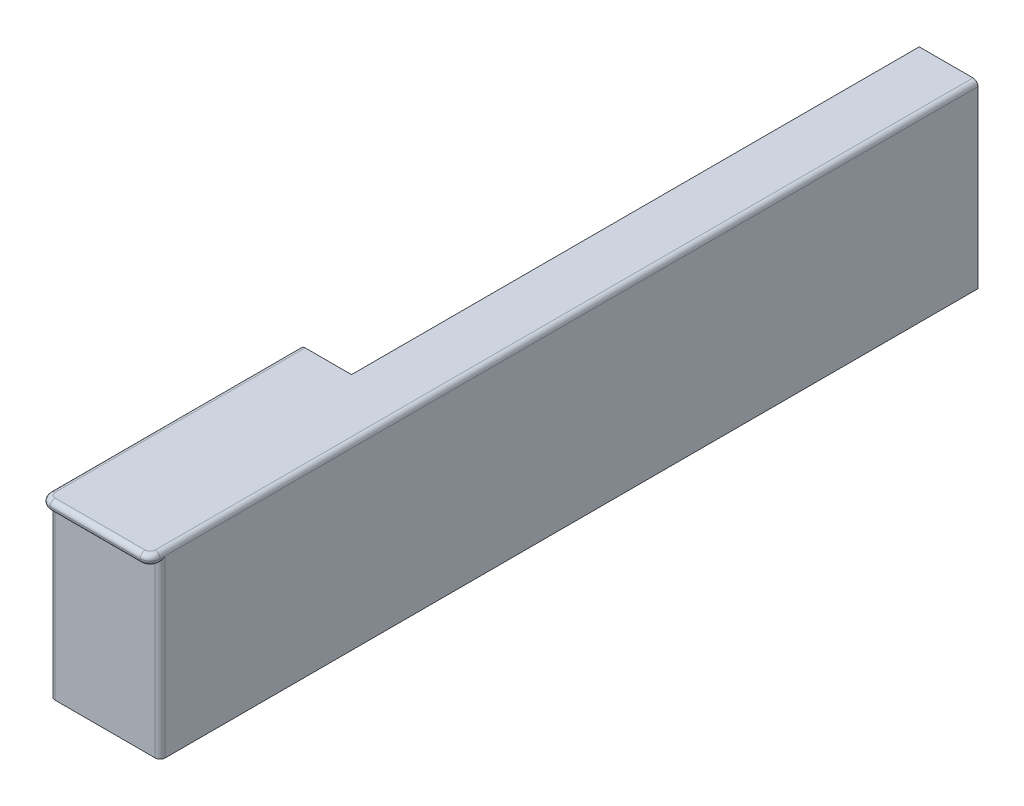
ISO-10303-21;
HEADER;
FILE_DESCRIPTION(('STEP AP214'),'2;1');
FILE_NAME('part.step','',(''),(''),'','','');
FILE_SCHEMA(('AUTOMOTIVE_DESIGN { 1 0 10303 214 1 1 1 1 }'));
ENDSEC;
DATA;
#1=APPLICATION_CONTEXT('core data for automotive mechanical design processes');
#2=APPLICATION_PROTOCOL_DEFINITION('international standard','automotive_design',2000,#1);
#3=PRODUCT_CONTEXT('',#1,'mechanical');
#4=PRODUCT('Part','Part','',(#3));
#5=PRODUCT_RELATED_PRODUCT_CATEGORY('part','',(#4));
#6=PRODUCT_DEFINITION_FORMATION('','',#4);
#7=PRODUCT_DEFINITION_CONTEXT('part definition',#1,'design');
#8=PRODUCT_DEFINITION('design','',#6,#7);
#9=PRODUCT_DEFINITION_SHAPE('','',#8);
#10=(LENGTH_UNIT() NAMED_UNIT(*) SI_UNIT(.MILLI.,.METRE.));
#11=(NAMED_UNIT(*) PLANE_ANGLE_UNIT() SI_UNIT($,.RADIAN.));
#12=(NAMED_UNIT(*) SI_UNIT($,.STERADIAN.) SOLID_ANGLE_UNIT());
#13=UNCERTAINTY_MEASURE_WITH_UNIT(LENGTH_MEASURE(1.E-05),#10,'distance_accuracy_value','');
#14=(GEOMETRIC_REPRESENTATION_CONTEXT(3) GLOBAL_UNCERTAINTY_ASSIGNED_CONTEXT((#13)) GLOBAL_UNIT_ASSIGNED_CONTEXT((#10,
#11,#12)) REPRESENTATION_CONTEXT('',''));
#15=CARTESIAN_POINT('',(0.,0.,0.));
#16=DIRECTION('',(0.,0.,1.));
#17=DIRECTION('',(1.,0.,0.));
#18=AXIS2_PLACEMENT_3D('',#15,#16,#17);
#19=CARTESIAN_POINT('',(-11.,36.,81.75));
#20=DIRECTION('',(0.,0.,-1.));
#21=DIRECTION('',(-1.,0.,0.));
#22=AXIS2_PLACEMENT_3D('',#19,#20,#21);
#23=PLANE('',#22);
#24=DIRECTION('',(1.,0.,0.));
#25=VECTOR('',#24,1.);
#26=CARTESIAN_POINT('',(-11.,34.,81.75));
#27=LINE('',#26,#25);
#28=CARTESIAN_POINT('',(-10.,34.,81.75));
#29=VERTEX_POINT('',#28);
#30=CARTESIAN_POINT('',(10.,34.,81.75));
#31=VERTEX_POINT('',#30);
#32=EDGE_CURVE('E213',#29,#31,#27,.T.);
#33=ORIENTED_EDGE('',*,*,#32,.F.);
#34=DIRECTION('',(0.,-1.,0.));
#35=VECTOR('',#34,1.);
#36=CARTESIAN_POINT('',(-10.,0.,81.75));
#37=LINE('',#36,#35);
#38=CARTESIAN_POINT('',(-10.,0.,81.75));
#39=VERTEX_POINT('',#38);
#40=EDGE_CURVE('E158',#29,#39,#37,.T.);
#41=ORIENTED_EDGE('',*,*,#40,.T.);
#42=DIRECTION('',(1.,0.,0.));
#43=VECTOR('',#42,1.);
#44=CARTESIAN_POINT('',(-11.,0.,81.75));
#45=LINE('',#44,#43);
#46=CARTESIAN_POINT('',(10.,0.,81.75));
#47=VERTEX_POINT('',#46);
#48=EDGE_CURVE('E215',#39,#47,#45,.T.);
#49=ORIENTED_EDGE('',*,*,#48,.T.);
#50=DIRECTION('',(0.,-1.,0.));
#51=VECTOR('',#50,1.);
#52=CARTESIAN_POINT('',(10.,36.,81.75));
#53=LINE('',#52,#51);
#54=EDGE_CURVE('E235',#47,#31,#53,.F.);
#55=ORIENTED_EDGE('',*,*,#54,.T.);
#56=EDGE_LOOP('',(#33,#41,#49,#55));
#57=FACE_BOUND('',#56,.T.);
#58=ADVANCED_FACE('F45',(#57),#23,.F.);
#59=CARTESIAN_POINT('',(-10.,36.,80.75));
#60=DIRECTION('',(0.,1.,0.));
#61=DIRECTION('',(0.,0.,1.));
#62=AXIS2_PLACEMENT_3D('',#59,#60,#61);
#63=CYLINDRICAL_SURFACE('',#62,1.);
#64=ORIENTED_EDGE('',*,*,#40,.F.);
#65=CARTESIAN_POINT('',(-10.,35.,80.75));
#66=DIRECTION('',(0.,-0.707106781186547,-0.707106781186547));
#67=DIRECTION('',(0.,0.707106781186547,-0.707106781186547));
#68=AXIS2_PLACEMENT_3D('',#65,#66,#67);
#69=ELLIPSE('',#68,1.41421356237309,1.);
#70=CARTESIAN_POINT('',(-11.,35.,80.75));
#71=VERTEX_POINT('',#70);
#72=EDGE_CURVE('E156',#29,#71,#69,.T.);
#73=ORIENTED_EDGE('',*,*,#72,.T.);
#74=DIRECTION('',(0.,-1.,0.));
#75=VECTOR('',#74,1.);
#76=CARTESIAN_POINT('',(-11.,36.,80.75));
#77=LINE('',#76,#75);
#78=CARTESIAN_POINT('',(-11.,0.,80.75));
#79=VERTEX_POINT('',#78);
#80=EDGE_CURVE('E143',#79,#71,#77,.F.);
#81=ORIENTED_EDGE('',*,*,#80,.F.);
#82=CARTESIAN_POINT('',(-10.,0.,80.75));
#83=DIRECTION('',(0.,1.,0.));
#84=DIRECTION('',(0.,0.,1.));
#85=AXIS2_PLACEMENT_3D('',#82,#83,#84);
#86=CIRCLE('',#85,1.);
#87=EDGE_CURVE('E153',#39,#79,#86,.F.);
#88=ORIENTED_EDGE('',*,*,#87,.F.);
#89=EDGE_LOOP('',(#64,#73,#81,#88));
#90=FACE_BOUND('',#89,.T.);
#91=ADVANCED_FACE('F157',(#90),#63,.T.);
#92=CARTESIAN_POINT('',(10.,36.,80.75));
#93=DIRECTION('',(0.,-1.,0.));
#94=DIRECTION('',(0.,0.,-1.));
#95=AXIS2_PLACEMENT_3D('',#92,#93,#94);
#96=CYLINDRICAL_SURFACE('',#95,1.);
#97=DIRECTION('',(0.,-1.,0.));
#98=VECTOR('',#97,1.);
#99=CARTESIAN_POINT('',(11.,36.,80.75));
#100=LINE('',#99,#98);
#101=CARTESIAN_POINT('',(11.,35.,80.75));
#102=VERTEX_POINT('',#101);
#103=CARTESIAN_POINT('',(11.,0.,80.75));
#104=VERTEX_POINT('',#103);
#105=EDGE_CURVE('E152',#102,#104,#100,.T.);
#106=ORIENTED_EDGE('',*,*,#105,.F.);
#107=CARTESIAN_POINT('',(10.,35.,80.75));
#108=DIRECTION('',(0.,-0.707106781186547,-0.707106781186547));
#109=DIRECTION('',(0.,0.707106781186547,-0.707106781186547));
#110=AXIS2_PLACEMENT_3D('',#107,#108,#109);
#111=ELLIPSE('',#110,1.41421356237309,1.);
#112=EDGE_CURVE('E53',#102,#31,#111,.T.);
#113=ORIENTED_EDGE('',*,*,#112,.T.);
#114=ORIENTED_EDGE('',*,*,#54,.F.);
#115=CARTESIAN_POINT('',(10.,0.,80.75));
#116=DIRECTION('',(0.,1.,0.));
#117=DIRECTION('',(0.,0.,1.));
#118=AXIS2_PLACEMENT_3D('',#115,#116,#117);
#119=CIRCLE('',#118,1.);
#120=EDGE_CURVE('E238',#104,#47,#119,.F.);
#121=ORIENTED_EDGE('',*,*,#120,.F.);
#122=EDGE_LOOP('',(#106,#113,#114,#121));
#123=FACE_BOUND('',#122,.T.);
#124=ADVANCED_FACE('F328',(#123),#96,.T.);
#125=CARTESIAN_POINT('',(11.,36.,81.75));
#126=DIRECTION('',(-1.,0.,0.));
#127=DIRECTION('',(0.,0.,1.));
#128=AXIS2_PLACEMENT_3D('',#125,#126,#127);
#129=PLANE('',#128);
#130=DIRECTION('',(0.,-1.,0.));
#131=VECTOR('',#130,1.);
#132=CARTESIAN_POINT('',(11.,36.,-81.75));
#133=LINE('',#132,#131);
#134=CARTESIAN_POINT('',(11.,35.,-81.75));
#135=VERTEX_POINT('',#134);
#136=CARTESIAN_POINT('',(11.,0.,-81.75));
#137=VERTEX_POINT('',#136);
#138=EDGE_CURVE('E226',#135,#137,#133,.T.);
#139=ORIENTED_EDGE('',*,*,#138,.F.);
#140=DIRECTION('',(0.,0.,-1.));
#141=VECTOR('',#140,1.);
#142=CARTESIAN_POINT('',(11.,35.,81.75));
#143=LINE('',#142,#141);
#144=EDGE_CURVE('E169',#135,#102,#143,.F.);
#145=ORIENTED_EDGE('',*,*,#144,.T.);
#146=ORIENTED_EDGE('',*,*,#105,.T.);
#147=DIRECTION('',(0.,0.,-1.));
#148=VECTOR('',#147,1.);
#149=CARTESIAN_POINT('',(11.,0.,81.75));
#150=LINE('',#149,#148);
#151=EDGE_CURVE('E220',#104,#137,#150,.T.);
#152=ORIENTED_EDGE('',*,*,#151,.T.);
#153=EDGE_LOOP('',(#139,#145,#146,#152));
#154=FACE_BOUND('',#153,.T.);
#155=ADVANCED_FACE('F263',(#154),#129,.F.);
#156=CARTESIAN_POINT('',(-11.,36.,-81.75));
#157=DIRECTION('',(0.,0.,-1.));
#158=DIRECTION('',(-1.,0.,0.));
#159=AXIS2_PLACEMENT_3D('',#156,#157,#158);
#160=PLANE('',#159);
#161=DIRECTION('',(0.,1.,0.));
#162=VECTOR('',#161,1.);
#163=CARTESIAN_POINT('',(-0.749999999999997,0.,-81.75));
#164=LINE('',#163,#162);
#165=CARTESIAN_POINT('',(-0.749999999999997,0.,-81.75));
#166=VERTEX_POINT('',#165);
#167=CARTESIAN_POINT('',(-0.749999999999997,36.,-81.75));
#168=VERTEX_POINT('',#167);
#169=EDGE_CURVE('E185',#166,#168,#164,.T.);
#170=ORIENTED_EDGE('',*,*,#169,.T.);
#171=DIRECTION('',(1.,0.,0.));
#172=VECTOR('',#171,1.);
#173=CARTESIAN_POINT('',(-11.,36.,-81.75));
#174=LINE('',#173,#172);
#175=CARTESIAN_POINT('',(10.,36.,-81.75));
#176=VERTEX_POINT('',#175);
#177=EDGE_CURVE('E225',#168,#176,#174,.T.);
#178=ORIENTED_EDGE('',*,*,#177,.T.);
#179=CARTESIAN_POINT('',(10.,35.,-81.75));
#180=DIRECTION('',(0.,0.,-1.));
#181=DIRECTION('',(-1.,0.,0.));
#182=AXIS2_PLACEMENT_3D('',#179,#180,#181);
#183=CIRCLE('',#182,1.);
#184=EDGE_CURVE('E174',#176,#135,#183,.T.);
#185=ORIENTED_EDGE('',*,*,#184,.T.);
#186=ORIENTED_EDGE('',*,*,#138,.T.);
#187=DIRECTION('',(1.,0.,0.));
#188=VECTOR('',#187,1.);
#189=CARTESIAN_POINT('',(-11.,0.,-81.75));
#190=LINE('',#189,#188);
#191=EDGE_CURVE('E230',#166,#137,#190,.T.);
#192=ORIENTED_EDGE('',*,*,#191,.F.);
#193=EDGE_LOOP('',(#170,#178,#185,#186,#192));
#194=FACE_BOUND('',#193,.T.);
#195=ADVANCED_FACE('F256',(#194),#160,.T.);
#196=CARTESIAN_POINT('',(-11.,36.,81.75));
#197=DIRECTION('',(-1.,0.,0.));
#198=DIRECTION('',(0.,0.,1.));
#199=AXIS2_PLACEMENT_3D('',#196,#197,#198);
#200=PLANE('',#199);
#201=DIRECTION('',(0.,1.,0.));
#202=VECTOR('',#201,1.);
#203=CARTESIAN_POINT('',(-11.,0.,31.75));
#204=LINE('',#203,#202);
#205=CARTESIAN_POINT('',(-11.,0.,31.75));
#206=VERTEX_POINT('',#205);
#207=CARTESIAN_POINT('',(-11.,35.,31.75));
#208=VERTEX_POINT('',#207);
#209=EDGE_CURVE('E59',#206,#208,#204,.T.);
#210=ORIENTED_EDGE('',*,*,#209,.F.);
#211=DIRECTION('',(0.,0.,-1.));
#212=VECTOR('',#211,1.);
#213=CARTESIAN_POINT('',(-11.,0.,81.75));
#214=LINE('',#213,#212);
#215=EDGE_CURVE('E149',#79,#206,#214,.T.);
#216=ORIENTED_EDGE('',*,*,#215,.F.);
#217=ORIENTED_EDGE('',*,*,#80,.T.);
#218=DIRECTION('',(0.,0.,-1.));
#219=VECTOR('',#218,1.);
#220=CARTESIAN_POINT('',(-11.,35.,81.75));
#221=LINE('',#220,#219);
#222=EDGE_CURVE('E147',#71,#208,#221,.T.);
#223=ORIENTED_EDGE('',*,*,#222,.T.);
#224=EDGE_LOOP('',(#210,#216,#217,#223));
#225=FACE_BOUND('',#224,.T.);
#226=ADVANCED_FACE('F145',(#225),#200,.T.);
#227=CARTESIAN_POINT('',(0.,36.,0.));
#228=DIRECTION('',(0.,1.,0.));
#229=DIRECTION('',(0.,0.,1.));
#230=AXIS2_PLACEMENT_3D('',#227,#228,#229);
#231=PLANE('',#230);
#232=DIRECTION('',(0.,0.,-1.));
#233=VECTOR('',#232,1.);
#234=CARTESIAN_POINT('',(-0.749999999999997,36.,-81.75));
#235=LINE('',#234,#233);
#236=CARTESIAN_POINT('',(-0.749999999999983,36.,31.75));
#237=VERTEX_POINT('',#236);
#238=EDGE_CURVE('E298',#237,#168,#235,.T.);
#239=ORIENTED_EDGE('',*,*,#238,.F.);
#240=DIRECTION('',(1.,0.,0.));
#241=VECTOR('',#240,1.);
#242=CARTESIAN_POINT('',(-11.,36.,31.75));
#243=LINE('',#242,#241);
#244=CARTESIAN_POINT('',(-10.,36.,31.75));
#245=VERTEX_POINT('',#244);
#246=EDGE_CURVE('E295',#245,#237,#243,.T.);
#247=ORIENTED_EDGE('',*,*,#246,.F.);
#248=DIRECTION('',(0.,0.,-1.));
#249=VECTOR('',#248,1.);
#250=CARTESIAN_POINT('',(-10.,36.,0.));
#251=LINE('',#250,#249);
#252=CARTESIAN_POINT('',(-10.,36.,81.75));
#253=VERTEX_POINT('',#252);
#254=EDGE_CURVE('E242',#245,#253,#251,.F.);
#255=ORIENTED_EDGE('',*,*,#254,.T.);
#256=CARTESIAN_POINT('',(-9.,36.,81.75));
#257=DIRECTION('',(0.,1.,0.));
#258=DIRECTION('',(0.,0.,1.));
#259=AXIS2_PLACEMENT_3D('',#256,#257,#258);
#260=CIRCLE('',#259,1.);
#261=CARTESIAN_POINT('',(-9.,36.,82.75));
#262=VERTEX_POINT('',#261);
#263=EDGE_CURVE('E244',#253,#262,#260,.T.);
#264=ORIENTED_EDGE('',*,*,#263,.T.);
#265=DIRECTION('',(1.,0.,0.));
#266=VECTOR('',#265,1.);
#267=CARTESIAN_POINT('',(0.,36.,82.75));
#268=LINE('',#267,#266);
#269=CARTESIAN_POINT('',(9.,36.,82.75));
#270=VERTEX_POINT('',#269);
#271=EDGE_CURVE('E246',#262,#270,#268,.T.);
#272=ORIENTED_EDGE('',*,*,#271,.T.);
#273=CARTESIAN_POINT('',(9.,36.,81.75));
#274=DIRECTION('',(0.,1.,0.));
#275=DIRECTION('',(0.,0.,1.));
#276=AXIS2_PLACEMENT_3D('',#273,#274,#275);
#277=CIRCLE('',#276,1.);
#278=CARTESIAN_POINT('',(10.,36.,81.75));
#279=VERTEX_POINT('',#278);
#280=EDGE_CURVE('E248',#270,#279,#277,.T.);
#281=ORIENTED_EDGE('',*,*,#280,.T.);
#282=DIRECTION('',(0.,0.,-1.));
#283=VECTOR('',#282,1.);
#284=CARTESIAN_POINT('',(10.,36.,-81.75));
#285=LINE('',#284,#283);
#286=EDGE_CURVE('E250',#279,#176,#285,.T.);
#287=ORIENTED_EDGE('',*,*,#286,.T.);
#288=ORIENTED_EDGE('',*,*,#177,.F.);
#289=EDGE_LOOP('',(#239,#247,#255,#264,#272,#281,#287,#288));
#290=FACE_BOUND('',#289,.T.);
#291=ADVANCED_FACE('F293',(#290),#231,.T.);
#292=CARTESIAN_POINT('',(0.,0.,0.));
#293=DIRECTION('',(0.,1.,0.));
#294=DIRECTION('',(0.,0.,1.));
#295=AXIS2_PLACEMENT_3D('',#292,#293,#294);
#296=PLANE('',#295);
#297=DIRECTION('',(1.,0.,0.));
#298=VECTOR('',#297,1.);
#299=CARTESIAN_POINT('',(-11.,0.,31.75));
#300=LINE('',#299,#298);
#301=CARTESIAN_POINT('',(-0.749999999999983,0.,31.75));
#302=VERTEX_POINT('',#301);
#303=EDGE_CURVE('E302',#206,#302,#300,.T.);
#304=ORIENTED_EDGE('',*,*,#303,.T.);
#305=DIRECTION('',(0.,0.,-1.));
#306=VECTOR('',#305,1.);
#307=CARTESIAN_POINT('',(-0.749999999999997,0.,-81.75));
#308=LINE('',#307,#306);
#309=EDGE_CURVE('E305',#302,#166,#308,.T.);
#310=ORIENTED_EDGE('',*,*,#309,.T.);
#311=ORIENTED_EDGE('',*,*,#191,.T.);
#312=ORIENTED_EDGE('',*,*,#151,.F.);
#313=ORIENTED_EDGE('',*,*,#120,.T.);
#314=ORIENTED_EDGE('',*,*,#48,.F.);
#315=ORIENTED_EDGE('',*,*,#87,.T.);
#316=ORIENTED_EDGE('',*,*,#215,.T.);
#317=EDGE_LOOP('',(#304,#310,#311,#312,#313,#314,#315,#316));
#318=FACE_BOUND('',#317,.T.);
#319=ADVANCED_FACE('F315',(#318),#296,.F.);
#320=CARTESIAN_POINT('',(0.,34.,0.));
#321=DIRECTION('',(0.,1.,0.));
#322=DIRECTION('',(0.,0.,1.));
#323=AXIS2_PLACEMENT_3D('',#320,#321,#322);
#324=PLANE('',#323);
#325=DIRECTION('',(1.,0.,0.));
#326=VECTOR('',#325,1.);
#327=CARTESIAN_POINT('',(-9.,34.,82.75));
#328=LINE('',#327,#326);
#329=CARTESIAN_POINT('',(9.,34.,82.75));
#330=VERTEX_POINT('',#329);
#331=CARTESIAN_POINT('',(-9.,34.,82.75));
#332=VERTEX_POINT('',#331);
#333=EDGE_CURVE('E68',#330,#332,#328,.F.);
#334=ORIENTED_EDGE('',*,*,#333,.T.);
#335=CARTESIAN_POINT('',(-9.,34.,81.75));
#336=DIRECTION('',(0.,1.,0.));
#337=DIRECTION('',(0.,0.,1.));
#338=AXIS2_PLACEMENT_3D('',#335,#336,#337);
#339=CIRCLE('',#338,1.);
#340=EDGE_CURVE('E159',#332,#29,#339,.F.);
#341=ORIENTED_EDGE('',*,*,#340,.T.);
#342=ORIENTED_EDGE('',*,*,#32,.T.);
#343=CARTESIAN_POINT('',(9.,34.,81.75));
#344=DIRECTION('',(0.,1.,0.));
#345=DIRECTION('',(0.,0.,1.));
#346=AXIS2_PLACEMENT_3D('',#343,#344,#345);
#347=CIRCLE('',#346,1.);
#348=EDGE_CURVE('E171',#31,#330,#347,.F.);
#349=ORIENTED_EDGE('',*,*,#348,.T.);
#350=EDGE_LOOP('',(#334,#341,#342,#349));
#351=FACE_BOUND('',#350,.T.);
#352=ADVANCED_FACE('F349',(#351),#324,.F.);
#353=CARTESIAN_POINT('',(-10.,35.,81.75));
#354=DIRECTION('',(0.,0.,-1.));
#355=DIRECTION('',(-1.,0.,0.));
#356=AXIS2_PLACEMENT_3D('',#353,#354,#355);
#357=CYLINDRICAL_SURFACE('',#356,1.);
#358=DIRECTION('',(0.,0.,1.));
#359=VECTOR('',#358,1.);
#360=CARTESIAN_POINT('',(-11.,35.,81.75));
#361=LINE('',#360,#359);
#362=CARTESIAN_POINT('',(-11.,35.,81.75));
#363=VERTEX_POINT('',#362);
#364=EDGE_CURVE('E161',#71,#363,#361,.T.);
#365=ORIENTED_EDGE('',*,*,#364,.F.);
#366=ORIENTED_EDGE('',*,*,#72,.F.);
#367=CARTESIAN_POINT('',(-10.,35.,81.75));
#368=DIRECTION('',(0.,0.,1.));
#369=DIRECTION('',(1.,0.,0.));
#370=AXIS2_PLACEMENT_3D('',#367,#368,#369);
#371=CIRCLE('',#370,1.);
#372=EDGE_CURVE('E90',#363,#29,#371,.T.);
#373=ORIENTED_EDGE('',*,*,#372,.F.);
#374=EDGE_LOOP('',(#365,#366,#373));
#375=FACE_BOUND('',#374,.T.);
#376=ADVANCED_FACE('F47',(#375),#357,.T.);
#377=CARTESIAN_POINT('',(-9.,35.,81.75));
#378=DIRECTION('',(0.,1.,0.));
#379=DIRECTION('',(0.,0.,1.));
#380=AXIS2_PLACEMENT_3D('',#377,#378,#379);
#381=DEGENERATE_TOROIDAL_SURFACE('',#380,1.,1.,.T.);
#382=ORIENTED_EDGE('',*,*,#372,.T.);
#383=ORIENTED_EDGE('',*,*,#340,.F.);
#384=CARTESIAN_POINT('',(-9.,35.,82.75));
#385=DIRECTION('',(1.,0.,0.));
#386=DIRECTION('',(0.,0.,-1.));
#387=AXIS2_PLACEMENT_3D('',#384,#385,#386);
#388=CIRCLE('',#387,1.);
#389=CARTESIAN_POINT('',(-9.,35.,83.75));
#390=VERTEX_POINT('',#389);
#391=EDGE_CURVE('E165',#390,#332,#388,.T.);
#392=ORIENTED_EDGE('',*,*,#391,.F.);
#393=CARTESIAN_POINT('',(-9.,35.,81.75));
#394=DIRECTION('',(0.,1.,0.));
#395=DIRECTION('',(0.,0.,1.));
#396=AXIS2_PLACEMENT_3D('',#393,#394,#395);
#397=CIRCLE('',#396,2.);
#398=EDGE_CURVE('E209',#363,#390,#397,.T.);
#399=ORIENTED_EDGE('',*,*,#398,.F.);
#400=EDGE_LOOP('',(#382,#383,#392,#399));
#401=FACE_BOUND('',#400,.T.);
#402=ADVANCED_FACE('F285',(#401),#381,.T.);
#403=CARTESIAN_POINT('',(-10.,35.,81.75));
#404=DIRECTION('',(0.,0.,-1.));
#405=DIRECTION('',(-1.,0.,0.));
#406=AXIS2_PLACEMENT_3D('',#403,#404,#405);
#407=CYLINDRICAL_SURFACE('',#406,1.);
#408=CARTESIAN_POINT('',(-10.,35.,31.75));
#409=DIRECTION('',(0.,0.,1.));
#410=DIRECTION('',(1.,0.,0.));
#411=AXIS2_PLACEMENT_3D('',#408,#409,#410);
#412=CIRCLE('',#411,1.);
#413=EDGE_CURVE('E11',#208,#245,#412,.F.);
#414=ORIENTED_EDGE('',*,*,#413,.F.);
#415=ORIENTED_EDGE('',*,*,#222,.F.);
#416=ORIENTED_EDGE('',*,*,#364,.T.);
#417=CARTESIAN_POINT('',(-10.,35.,81.75));
#418=DIRECTION('',(0.,0.,1.));
#419=DIRECTION('',(1.,0.,0.));
#420=AXIS2_PLACEMENT_3D('',#417,#418,#419);
#421=CIRCLE('',#420,1.);
#422=EDGE_CURVE('E206',#253,#363,#421,.T.);
#423=ORIENTED_EDGE('',*,*,#422,.F.);
#424=ORIENTED_EDGE('',*,*,#254,.F.);
#425=EDGE_LOOP('',(#414,#415,#416,#423,#424));
#426=FACE_BOUND('',#425,.T.);
#427=ADVANCED_FACE('F167',(#426),#407,.T.);
#428=CARTESIAN_POINT('',(-11.,35.,82.75));
#429=DIRECTION('',(-1.,0.,0.));
#430=DIRECTION('',(0.,0.,1.));
#431=AXIS2_PLACEMENT_3D('',#428,#429,#430);
#432=CYLINDRICAL_SURFACE('',#431,1.);
#433=ORIENTED_EDGE('',*,*,#391,.T.);
#434=ORIENTED_EDGE('',*,*,#333,.F.);
#435=CARTESIAN_POINT('',(9.,35.,82.75));
#436=DIRECTION('',(1.,0.,0.));
#437=DIRECTION('',(0.,0.,-1.));
#438=AXIS2_PLACEMENT_3D('',#435,#436,#437);
#439=CIRCLE('',#438,1.);
#440=CARTESIAN_POINT('',(9.,35.,83.75));
#441=VERTEX_POINT('',#440);
#442=EDGE_CURVE('E203',#441,#330,#439,.T.);
#443=ORIENTED_EDGE('',*,*,#442,.F.);
#444=DIRECTION('',(1.,0.,0.));
#445=VECTOR('',#444,1.);
#446=CARTESIAN_POINT('',(9.,35.,83.75));
#447=LINE('',#446,#445);
#448=EDGE_CURVE('E200',#390,#441,#447,.T.);
#449=ORIENTED_EDGE('',*,*,#448,.F.);
#450=EDGE_LOOP('',(#433,#434,#443,#449));
#451=FACE_BOUND('',#450,.T.);
#452=ADVANCED_FACE('F284',(#451),#432,.T.);
#453=CARTESIAN_POINT('',(-9.,35.,81.75));
#454=DIRECTION('',(0.,1.,0.));
#455=DIRECTION('',(0.,0.,1.));
#456=AXIS2_PLACEMENT_3D('',#453,#454,#455);
#457=DEGENERATE_TOROIDAL_SURFACE('',#456,1.,1.,.T.);
#458=ORIENTED_EDGE('',*,*,#422,.T.);
#459=ORIENTED_EDGE('',*,*,#398,.T.);
#460=CARTESIAN_POINT('',(-9.,35.,82.75));
#461=DIRECTION('',(1.,0.,0.));
#462=DIRECTION('',(0.,0.,-1.));
#463=AXIS2_PLACEMENT_3D('',#460,#461,#462);
#464=CIRCLE('',#463,1.);
#465=EDGE_CURVE('E197',#262,#390,#464,.T.);
#466=ORIENTED_EDGE('',*,*,#465,.F.);
#467=ORIENTED_EDGE('',*,*,#263,.F.);
#468=EDGE_LOOP('',(#458,#459,#466,#467));
#469=FACE_BOUND('',#468,.T.);
#470=ADVANCED_FACE('F287',(#469),#457,.T.);
#471=CARTESIAN_POINT('',(9.,35.,81.75));
#472=DIRECTION('',(0.,1.,0.));
#473=DIRECTION('',(0.,0.,1.));
#474=AXIS2_PLACEMENT_3D('',#471,#472,#473);
#475=DEGENERATE_TOROIDAL_SURFACE('',#474,1.,1.,.T.);
#476=ORIENTED_EDGE('',*,*,#442,.T.);
#477=ORIENTED_EDGE('',*,*,#348,.F.);
#478=CARTESIAN_POINT('',(10.,35.,81.75));
#479=DIRECTION('',(0.,0.,-1.));
#480=DIRECTION('',(-1.,0.,0.));
#481=AXIS2_PLACEMENT_3D('',#478,#479,#480);
#482=CIRCLE('',#481,1.);
#483=CARTESIAN_POINT('',(11.,35.,81.75));
#484=VERTEX_POINT('',#483);
#485=EDGE_CURVE('E194',#484,#31,#482,.T.);
#486=ORIENTED_EDGE('',*,*,#485,.F.);
#487=CARTESIAN_POINT('',(9.,35.,81.75));
#488=DIRECTION('',(0.,1.,0.));
#489=DIRECTION('',(0.,0.,1.));
#490=AXIS2_PLACEMENT_3D('',#487,#488,#489);
#491=CIRCLE('',#490,2.);
#492=EDGE_CURVE('E191',#441,#484,#491,.T.);
#493=ORIENTED_EDGE('',*,*,#492,.F.);
#494=EDGE_LOOP('',(#476,#477,#486,#493));
#495=FACE_BOUND('',#494,.T.);
#496=ADVANCED_FACE('F273',(#495),#475,.T.);
#497=CARTESIAN_POINT('',(0.,35.,82.75));
#498=DIRECTION('',(1.,0.,0.));
#499=DIRECTION('',(0.,0.,-1.));
#500=AXIS2_PLACEMENT_3D('',#497,#498,#499);
#501=CYLINDRICAL_SURFACE('',#500,1.);
#502=ORIENTED_EDGE('',*,*,#465,.T.);
#503=ORIENTED_EDGE('',*,*,#448,.T.);
#504=CARTESIAN_POINT('',(9.,35.,82.75));
#505=DIRECTION('',(1.,0.,0.));
#506=DIRECTION('',(0.,0.,-1.));
#507=AXIS2_PLACEMENT_3D('',#504,#505,#506);
#508=CIRCLE('',#507,1.);
#509=EDGE_CURVE('E188',#270,#441,#508,.T.);
#510=ORIENTED_EDGE('',*,*,#509,.F.);
#511=ORIENTED_EDGE('',*,*,#271,.F.);
#512=EDGE_LOOP('',(#502,#503,#510,#511));
#513=FACE_BOUND('',#512,.T.);
#514=ADVANCED_FACE('F280',(#513),#501,.T.);
#515=CARTESIAN_POINT('',(10.,35.,81.75));
#516=DIRECTION('',(0.,0.,-1.));
#517=DIRECTION('',(-1.,0.,0.));
#518=AXIS2_PLACEMENT_3D('',#515,#516,#517);
#519=CYLINDRICAL_SURFACE('',#518,1.);
#520=ORIENTED_EDGE('',*,*,#485,.T.);
#521=ORIENTED_EDGE('',*,*,#112,.F.);
#522=DIRECTION('',(0.,0.,-1.));
#523=VECTOR('',#522,1.);
#524=CARTESIAN_POINT('',(11.,35.,81.75));
#525=LINE('',#524,#523);
#526=EDGE_CURVE('E184',#484,#102,#525,.T.);
#527=ORIENTED_EDGE('',*,*,#526,.F.);
#528=EDGE_LOOP('',(#520,#521,#527));
#529=FACE_BOUND('',#528,.T.);
#530=ADVANCED_FACE('F269',(#529),#519,.T.);
#531=CARTESIAN_POINT('',(9.,35.,81.75));
#532=DIRECTION('',(0.,1.,0.));
#533=DIRECTION('',(0.,0.,1.));
#534=AXIS2_PLACEMENT_3D('',#531,#532,#533);
#535=DEGENERATE_TOROIDAL_SURFACE('',#534,1.,1.,.T.);
#536=ORIENTED_EDGE('',*,*,#509,.T.);
#537=ORIENTED_EDGE('',*,*,#492,.T.);
#538=CARTESIAN_POINT('',(10.,35.,81.75));
#539=DIRECTION('',(0.,0.,-1.));
#540=DIRECTION('',(-1.,0.,0.));
#541=AXIS2_PLACEMENT_3D('',#538,#539,#540);
#542=CIRCLE('',#541,1.);
#543=EDGE_CURVE('E181',#279,#484,#542,.T.);
#544=ORIENTED_EDGE('',*,*,#543,.F.);
#545=ORIENTED_EDGE('',*,*,#280,.F.);
#546=EDGE_LOOP('',(#536,#537,#544,#545));
#547=FACE_BOUND('',#546,.T.);
#548=ADVANCED_FACE('F275',(#547),#535,.T.);
#549=CARTESIAN_POINT('',(10.,35.,0.));
#550=DIRECTION('',(0.,0.,1.));
#551=DIRECTION('',(1.,0.,0.));
#552=AXIS2_PLACEMENT_3D('',#549,#550,#551);
#553=CYLINDRICAL_SURFACE('',#552,1.);
#554=ORIENTED_EDGE('',*,*,#526,.T.);
#555=ORIENTED_EDGE('',*,*,#144,.F.);
#556=ORIENTED_EDGE('',*,*,#184,.F.);
#557=ORIENTED_EDGE('',*,*,#286,.F.);
#558=ORIENTED_EDGE('',*,*,#543,.T.);
#559=EDGE_LOOP('',(#554,#555,#556,#557,#558));
#560=FACE_BOUND('',#559,.T.);
#561=ADVANCED_FACE('F265',(#560),#553,.T.);
#562=CARTESIAN_POINT('',(-0.749999999999997,0.,-81.75));
#563=DIRECTION('',(1.,0.,0.));
#564=DIRECTION('',(0.,0.,-1.));
#565=AXIS2_PLACEMENT_3D('',#562,#563,#564);
#566=PLANE('',#565);
#567=ORIENTED_EDGE('',*,*,#238,.T.);
#568=ORIENTED_EDGE('',*,*,#169,.F.);
#569=ORIENTED_EDGE('',*,*,#309,.F.);
#570=DIRECTION('',(0.,1.,0.));
#571=VECTOR('',#570,1.);
#572=CARTESIAN_POINT('',(-0.749999999999983,0.,31.75));
#573=LINE('',#572,#571);
#574=EDGE_CURVE('E308',#302,#237,#573,.T.);
#575=ORIENTED_EDGE('',*,*,#574,.T.);
#576=EDGE_LOOP('',(#567,#568,#569,#575));
#577=FACE_BOUND('',#576,.T.);
#578=ADVANCED_FACE('F324',(#577),#566,.F.);
#579=CARTESIAN_POINT('',(-11.,0.,31.75));
#580=DIRECTION('',(0.,0.,1.));
#581=DIRECTION('',(1.,0.,0.));
#582=AXIS2_PLACEMENT_3D('',#579,#580,#581);
#583=PLANE('',#582);
#584=ORIENTED_EDGE('',*,*,#413,.T.);
#585=ORIENTED_EDGE('',*,*,#246,.T.);
#586=ORIENTED_EDGE('',*,*,#574,.F.);
#587=ORIENTED_EDGE('',*,*,#303,.F.);
#588=ORIENTED_EDGE('',*,*,#209,.T.);
#589=EDGE_LOOP('',(#584,#585,#586,#587,#588));
#590=FACE_BOUND('',#589,.T.);
#591=ADVANCED_FACE('F318',(#590),#583,.F.);
#592=CLOSED_SHELL('',(#58,#91,#124,#155,#195,#226,#291,#319,#352,#376,#402,#427,#452,#470,#496,
#514,#530,#548,#561,#578,#591));
#593=MANIFOLD_SOLID_BREP('B2',#592);
#594=ADVANCED_BREP_SHAPE_REPRESENTATION('',(#18,#593),#14);
#595=SHAPE_DEFINITION_REPRESENTATION(#9,#594);
ENDSEC;
END-ISO-10303-21;
